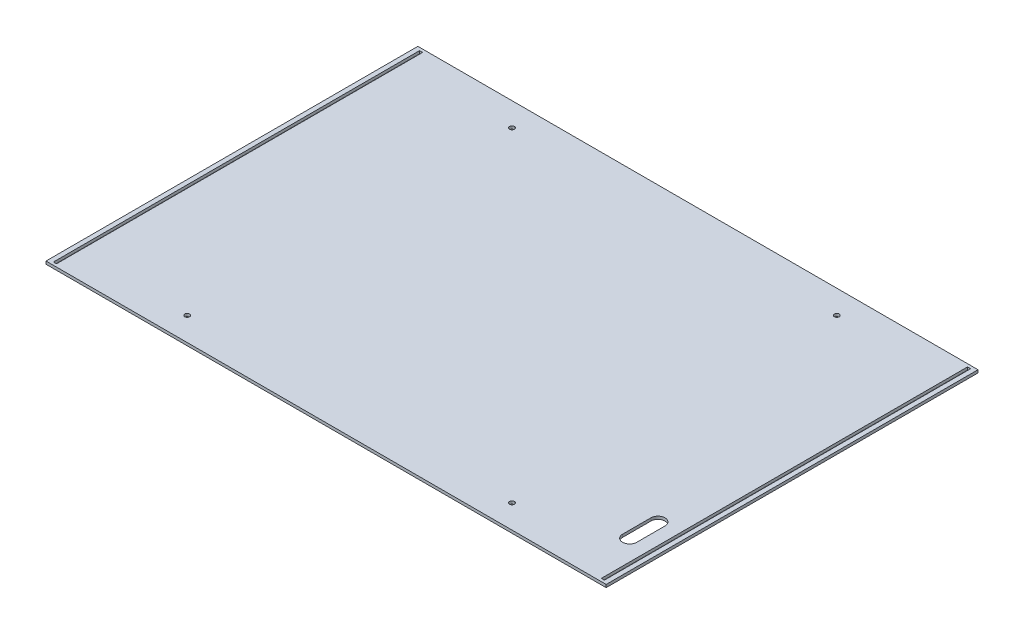
ISO-10303-21;
HEADER;
FILE_DESCRIPTION(('STEP AP214'),'2;1');
FILE_NAME('part.step','',(''),(''),'','','');
FILE_SCHEMA(('AUTOMOTIVE_DESIGN { 1 0 10303 214 1 1 1 1 }'));
ENDSEC;
DATA;
#1=APPLICATION_CONTEXT('core data for automotive mechanical design processes');
#2=APPLICATION_PROTOCOL_DEFINITION('international standard','automotive_design',2000,#1);
#3=PRODUCT_CONTEXT('',#1,'mechanical');
#4=PRODUCT('Part','Part','',(#3));
#5=PRODUCT_RELATED_PRODUCT_CATEGORY('part','',(#4));
#6=PRODUCT_DEFINITION_FORMATION('','',#4);
#7=PRODUCT_DEFINITION_CONTEXT('part definition',#1,'design');
#8=PRODUCT_DEFINITION('design','',#6,#7);
#9=PRODUCT_DEFINITION_SHAPE('','',#8);
#10=(LENGTH_UNIT() NAMED_UNIT(*) SI_UNIT(.MILLI.,.METRE.));
#11=(NAMED_UNIT(*) PLANE_ANGLE_UNIT() SI_UNIT($,.RADIAN.));
#12=(NAMED_UNIT(*) SI_UNIT($,.STERADIAN.) SOLID_ANGLE_UNIT());
#13=UNCERTAINTY_MEASURE_WITH_UNIT(LENGTH_MEASURE(1.E-05),#10,'distance_accuracy_value','');
#14=(GEOMETRIC_REPRESENTATION_CONTEXT(3) GLOBAL_UNCERTAINTY_ASSIGNED_CONTEXT((#13)) GLOBAL_UNIT_ASSIGNED_CONTEXT((#10,
#11,#12)) REPRESENTATION_CONTEXT('',''));
#15=CARTESIAN_POINT('',(0.,0.,0.));
#16=DIRECTION('',(0.,0.,1.));
#17=DIRECTION('',(1.,0.,0.));
#18=AXIS2_PLACEMENT_3D('',#15,#16,#17);
#19=CARTESIAN_POINT('',(297.5,3.,-197.5));
#20=DIRECTION('',(-1.,0.,0.));
#21=DIRECTION('',(0.,0.,1.));
#22=AXIS2_PLACEMENT_3D('',#19,#20,#21);
#23=PLANE('',#22);
#24=DIRECTION('',(0.,0.,-1.));
#25=VECTOR('',#24,1.);
#26=CARTESIAN_POINT('',(297.5,0.,-197.5));
#27=LINE('',#26,#25);
#28=CARTESIAN_POINT('',(297.5,0.,197.5));
#29=VERTEX_POINT('',#28);
#30=CARTESIAN_POINT('',(297.5,0.,-197.5));
#31=VERTEX_POINT('',#30);
#32=EDGE_CURVE('E266',#29,#31,#27,.T.);
#33=ORIENTED_EDGE('',*,*,#32,.T.);
#34=DIRECTION('',(0.,-1.,0.));
#35=VECTOR('',#34,1.);
#36=CARTESIAN_POINT('',(297.5,3.,-197.5));
#37=LINE('',#36,#35);
#38=CARTESIAN_POINT('',(297.5,3.,-197.5));
#39=VERTEX_POINT('',#38);
#40=EDGE_CURVE('E313',#39,#31,#37,.T.);
#41=ORIENTED_EDGE('',*,*,#40,.F.);
#42=DIRECTION('',(0.,0.,-1.));
#43=VECTOR('',#42,1.);
#44=CARTESIAN_POINT('',(297.5,3.,-197.5));
#45=LINE('',#44,#43);
#46=CARTESIAN_POINT('',(297.5,3.,197.5));
#47=VERTEX_POINT('',#46);
#48=EDGE_CURVE('E276',#47,#39,#45,.T.);
#49=ORIENTED_EDGE('',*,*,#48,.F.);
#50=DIRECTION('',(0.,-1.,0.));
#51=VECTOR('',#50,1.);
#52=CARTESIAN_POINT('',(297.5,3.,197.5));
#53=LINE('',#52,#51);
#54=EDGE_CURVE('E290',#47,#29,#53,.T.);
#55=ORIENTED_EDGE('',*,*,#54,.T.);
#56=EDGE_LOOP('',(#33,#41,#49,#55));
#57=FACE_BOUND('',#56,.T.);
#58=ADVANCED_FACE('F38',(#57),#23,.F.);
#59=CARTESIAN_POINT('',(-297.5,3.,-197.5));
#60=DIRECTION('',(0.,0.,1.));
#61=DIRECTION('',(1.,0.,0.));
#62=AXIS2_PLACEMENT_3D('',#59,#60,#61);
#63=PLANE('',#62);
#64=DIRECTION('',(-1.,0.,0.));
#65=VECTOR('',#64,1.);
#66=CARTESIAN_POINT('',(-297.5,0.,-197.5));
#67=LINE('',#66,#65);
#68=CARTESIAN_POINT('',(-297.5,0.,-197.5));
#69=VERTEX_POINT('',#68);
#70=EDGE_CURVE('E294',#31,#69,#67,.T.);
#71=ORIENTED_EDGE('',*,*,#70,.T.);
#72=DIRECTION('',(0.,-1.,0.));
#73=VECTOR('',#72,1.);
#74=CARTESIAN_POINT('',(-297.5,3.,-197.5));
#75=LINE('',#74,#73);
#76=CARTESIAN_POINT('',(-297.5,3.,-197.5));
#77=VERTEX_POINT('',#76);
#78=EDGE_CURVE('E309',#77,#69,#75,.T.);
#79=ORIENTED_EDGE('',*,*,#78,.F.);
#80=DIRECTION('',(-1.,0.,0.));
#81=VECTOR('',#80,1.);
#82=CARTESIAN_POINT('',(-297.5,3.,-197.5));
#83=LINE('',#82,#81);
#84=EDGE_CURVE('E280',#39,#77,#83,.T.);
#85=ORIENTED_EDGE('',*,*,#84,.F.);
#86=ORIENTED_EDGE('',*,*,#40,.T.);
#87=EDGE_LOOP('',(#71,#79,#85,#86));
#88=FACE_BOUND('',#87,.T.);
#89=ADVANCED_FACE('F360',(#88),#63,.F.);
#90=CARTESIAN_POINT('',(-297.5,3.,-197.5));
#91=DIRECTION('',(1.,0.,0.));
#92=DIRECTION('',(0.,0.,-1.));
#93=AXIS2_PLACEMENT_3D('',#90,#91,#92);
#94=PLANE('',#93);
#95=DIRECTION('',(0.,0.,1.));
#96=VECTOR('',#95,1.);
#97=CARTESIAN_POINT('',(-297.5,0.,-197.5));
#98=LINE('',#97,#96);
#99=CARTESIAN_POINT('',(-297.5,0.,197.5));
#100=VERTEX_POINT('',#99);
#101=EDGE_CURVE('E297',#69,#100,#98,.T.);
#102=ORIENTED_EDGE('',*,*,#101,.T.);
#103=DIRECTION('',(0.,-1.,0.));
#104=VECTOR('',#103,1.);
#105=CARTESIAN_POINT('',(-297.5,3.,197.5));
#106=LINE('',#105,#104);
#107=CARTESIAN_POINT('',(-297.5,3.,197.5));
#108=VERTEX_POINT('',#107);
#109=EDGE_CURVE('E305',#108,#100,#106,.T.);
#110=ORIENTED_EDGE('',*,*,#109,.F.);
#111=DIRECTION('',(0.,0.,1.));
#112=VECTOR('',#111,1.);
#113=CARTESIAN_POINT('',(-297.5,3.,-197.5));
#114=LINE('',#113,#112);
#115=EDGE_CURVE('E284',#77,#108,#114,.T.);
#116=ORIENTED_EDGE('',*,*,#115,.F.);
#117=ORIENTED_EDGE('',*,*,#78,.T.);
#118=EDGE_LOOP('',(#102,#110,#116,#117));
#119=FACE_BOUND('',#118,.T.);
#120=ADVANCED_FACE('F365',(#119),#94,.F.);
#121=CARTESIAN_POINT('',(-297.5,3.,197.5));
#122=DIRECTION('',(0.,0.,-1.));
#123=DIRECTION('',(-1.,0.,0.));
#124=AXIS2_PLACEMENT_3D('',#121,#122,#123);
#125=PLANE('',#124);
#126=DIRECTION('',(1.,0.,0.));
#127=VECTOR('',#126,1.);
#128=CARTESIAN_POINT('',(-297.5,0.,197.5));
#129=LINE('',#128,#127);
#130=EDGE_CURVE('E281',#100,#29,#129,.T.);
#131=ORIENTED_EDGE('',*,*,#130,.T.);
#132=ORIENTED_EDGE('',*,*,#54,.F.);
#133=DIRECTION('',(1.,0.,0.));
#134=VECTOR('',#133,1.);
#135=CARTESIAN_POINT('',(-297.5,3.,197.5));
#136=LINE('',#135,#134);
#137=EDGE_CURVE('E287',#108,#47,#136,.T.);
#138=ORIENTED_EDGE('',*,*,#137,.F.);
#139=ORIENTED_EDGE('',*,*,#109,.T.);
#140=EDGE_LOOP('',(#131,#132,#138,#139));
#141=FACE_BOUND('',#140,.T.);
#142=ADVANCED_FACE('F378',(#141),#125,.F.);
#143=CARTESIAN_POINT('',(0.,3.,0.));
#144=DIRECTION('',(0.,1.,0.));
#145=DIRECTION('',(0.,0.,1.));
#146=AXIS2_PLACEMENT_3D('',#143,#144,#145);
#147=PLANE('',#146);
#148=CARTESIAN_POINT('',(-172.5,3.,-172.5));
#149=DIRECTION('',(0.,1.,0.));
#150=DIRECTION('',(0.,0.,1.));
#151=AXIS2_PLACEMENT_3D('',#148,#149,#150);
#152=CIRCLE('',#151,2.59999999999999);
#153=CARTESIAN_POINT('',(-172.5,3.,-169.9));
#154=VERTEX_POINT('',#153);
#155=EDGE_CURVE('E183',#154,#154,#152,.T.);
#156=ORIENTED_EDGE('',*,*,#155,.F.);
#157=EDGE_LOOP('',(#156));
#158=FACE_BOUND('',#157,.T.);
#159=CARTESIAN_POINT('',(172.5,3.,172.5));
#160=DIRECTION('',(0.,1.,0.));
#161=DIRECTION('',(0.,0.,1.));
#162=AXIS2_PLACEMENT_3D('',#159,#160,#161);
#163=CIRCLE('',#162,2.59999999999999);
#164=CARTESIAN_POINT('',(172.5,3.,175.1));
#165=VERTEX_POINT('',#164);
#166=EDGE_CURVE('E468',#165,#165,#163,.T.);
#167=ORIENTED_EDGE('',*,*,#166,.F.);
#168=EDGE_LOOP('',(#167));
#169=FACE_BOUND('',#168,.T.);
#170=CARTESIAN_POINT('',(-172.5,3.,172.5));
#171=DIRECTION('',(0.,1.,0.));
#172=DIRECTION('',(0.,0.,1.));
#173=AXIS2_PLACEMENT_3D('',#170,#171,#172);
#174=CIRCLE('',#173,2.59999999999999);
#175=CARTESIAN_POINT('',(-172.5,3.,175.1));
#176=VERTEX_POINT('',#175);
#177=EDGE_CURVE('E443',#176,#176,#174,.T.);
#178=ORIENTED_EDGE('',*,*,#177,.F.);
#179=EDGE_LOOP('',(#178));
#180=FACE_BOUND('',#179,.T.);
#181=CARTESIAN_POINT('',(172.5,3.,-172.5));
#182=DIRECTION('',(0.,1.,0.));
#183=DIRECTION('',(0.,0.,1.));
#184=AXIS2_PLACEMENT_3D('',#181,#182,#183);
#185=CIRCLE('',#184,2.59999999999999);
#186=CARTESIAN_POINT('',(172.5,3.,-169.9));
#187=VERTEX_POINT('',#186);
#188=EDGE_CURVE('E455',#187,#187,#185,.T.);
#189=ORIENTED_EDGE('',*,*,#188,.F.);
#190=EDGE_LOOP('',(#189));
#191=FACE_BOUND('',#190,.T.);
#192=DIRECTION('',(0.,0.,1.));
#193=VECTOR('',#192,1.);
#194=CARTESIAN_POINT('',(-292.65,3.,0.));
#195=LINE('',#194,#193);
#196=CARTESIAN_POINT('',(-292.650000000001,3.,-194.500000000001));
#197=VERTEX_POINT('',#196);
#198=CARTESIAN_POINT('',(-292.65,3.,194.499999999999));
#199=VERTEX_POINT('',#198);
#200=EDGE_CURVE('E156',#197,#199,#195,.T.);
#201=ORIENTED_EDGE('',*,*,#200,.F.);
#202=DIRECTION('',(-1.,0.,0.));
#203=VECTOR('',#202,1.);
#204=CARTESIAN_POINT('',(0.,3.,-194.500000000001));
#205=LINE('',#204,#203);
#206=CARTESIAN_POINT('',(-289.35,3.,-194.500000000001));
#207=VERTEX_POINT('',#206);
#208=EDGE_CURVE('E242',#207,#197,#205,.T.);
#209=ORIENTED_EDGE('',*,*,#208,.F.);
#210=DIRECTION('',(0.,0.,-1.));
#211=VECTOR('',#210,1.);
#212=CARTESIAN_POINT('',(-289.35,3.,0.));
#213=LINE('',#212,#211);
#214=CARTESIAN_POINT('',(-289.35,3.,194.499999999999));
#215=VERTEX_POINT('',#214);
#216=EDGE_CURVE('E239',#215,#207,#213,.T.);
#217=ORIENTED_EDGE('',*,*,#216,.F.);
#218=DIRECTION('',(1.,0.,0.));
#219=VECTOR('',#218,1.);
#220=CARTESIAN_POINT('',(0.,3.,194.499999999999));
#221=LINE('',#220,#219);
#222=EDGE_CURVE('E236',#199,#215,#221,.T.);
#223=ORIENTED_EDGE('',*,*,#222,.F.);
#224=EDGE_LOOP('',(#201,#209,#217,#223));
#225=FACE_BOUND('',#224,.T.);
#226=DIRECTION('',(0.,0.,-1.));
#227=VECTOR('',#226,1.);
#228=CARTESIAN_POINT('',(292.65,3.,0.));
#229=LINE('',#228,#227);
#230=CARTESIAN_POINT('',(292.65,3.,194.500000000003));
#231=VERTEX_POINT('',#230);
#232=CARTESIAN_POINT('',(292.65,3.,-194.499999999997));
#233=VERTEX_POINT('',#232);
#234=EDGE_CURVE('E233',#231,#233,#229,.T.);
#235=ORIENTED_EDGE('',*,*,#234,.F.);
#236=DIRECTION('',(1.,0.,0.));
#237=VECTOR('',#236,1.);
#238=CARTESIAN_POINT('',(0.,3.,194.500000000003));
#239=LINE('',#238,#237);
#240=CARTESIAN_POINT('',(289.35,3.,194.500000000003));
#241=VERTEX_POINT('',#240);
#242=EDGE_CURVE('E230',#241,#231,#239,.T.);
#243=ORIENTED_EDGE('',*,*,#242,.F.);
#244=DIRECTION('',(0.,0.,1.));
#245=VECTOR('',#244,1.);
#246=CARTESIAN_POINT('',(289.35,3.,0.));
#247=LINE('',#246,#245);
#248=CARTESIAN_POINT('',(289.35,3.,-194.499999999997));
#249=VERTEX_POINT('',#248);
#250=EDGE_CURVE('E227',#249,#241,#247,.T.);
#251=ORIENTED_EDGE('',*,*,#250,.F.);
#252=DIRECTION('',(-1.,0.,0.));
#253=VECTOR('',#252,1.);
#254=CARTESIAN_POINT('',(0.,3.,-194.499999999997));
#255=LINE('',#254,#253);
#256=EDGE_CURVE('E193',#233,#249,#255,.T.);
#257=ORIENTED_EDGE('',*,*,#256,.F.);
#258=EDGE_LOOP('',(#235,#243,#251,#257));
#259=FACE_BOUND('',#258,.T.);
#260=CARTESIAN_POINT('',(267.5,3.,112.5));
#261=DIRECTION('',(0.,1.,0.));
#262=DIRECTION('',(0.,0.,1.));
#263=AXIS2_PLACEMENT_3D('',#260,#261,#262);
#264=CIRCLE('',#263,7.50000000000001);
#265=CARTESIAN_POINT('',(275.,3.,112.5));
#266=VERTEX_POINT('',#265);
#267=CARTESIAN_POINT('',(260.,3.,112.5));
#268=VERTEX_POINT('',#267);
#269=EDGE_CURVE('E247',#266,#268,#264,.T.);
#270=ORIENTED_EDGE('',*,*,#269,.F.);
#271=DIRECTION('',(0.,0.,-1.));
#272=VECTOR('',#271,1.);
#273=CARTESIAN_POINT('',(275.,3.,112.5));
#274=LINE('',#273,#272);
#275=CARTESIAN_POINT('',(275.,3.,142.5));
#276=VERTEX_POINT('',#275);
#277=EDGE_CURVE('E258',#276,#266,#274,.T.);
#278=ORIENTED_EDGE('',*,*,#277,.F.);
#279=CARTESIAN_POINT('',(267.5,3.,142.5));
#280=DIRECTION('',(0.,1.,0.));
#281=DIRECTION('',(0.,0.,1.));
#282=AXIS2_PLACEMENT_3D('',#279,#280,#281);
#283=CIRCLE('',#282,7.50000000000001);
#284=CARTESIAN_POINT('',(260.,3.,142.5));
#285=VERTEX_POINT('',#284);
#286=EDGE_CURVE('E254',#285,#276,#283,.T.);
#287=ORIENTED_EDGE('',*,*,#286,.F.);
#288=DIRECTION('',(0.,0.,1.));
#289=VECTOR('',#288,1.);
#290=CARTESIAN_POINT('',(260.,3.,112.5));
#291=LINE('',#290,#289);
#292=EDGE_CURVE('E250',#268,#285,#291,.T.);
#293=ORIENTED_EDGE('',*,*,#292,.F.);
#294=EDGE_LOOP('',(#270,#278,#287,#293));
#295=FACE_BOUND('',#294,.T.);
#296=ORIENTED_EDGE('',*,*,#48,.T.);
#297=ORIENTED_EDGE('',*,*,#84,.T.);
#298=ORIENTED_EDGE('',*,*,#115,.T.);
#299=ORIENTED_EDGE('',*,*,#137,.T.);
#300=EDGE_LOOP('',(#296,#297,#298,#299));
#301=FACE_BOUND('',#300,.T.);
#302=ADVANCED_FACE('F340',(#158,#169,#180,#191,#225,#259,#295,#301),#147,.T.);
#303=CARTESIAN_POINT('',(0.,0.,0.));
#304=DIRECTION('',(0.,1.,0.));
#305=DIRECTION('',(0.,0.,1.));
#306=AXIS2_PLACEMENT_3D('',#303,#304,#305);
#307=PLANE('',#306);
#308=CARTESIAN_POINT('',(-172.5,0.,-172.5));
#309=DIRECTION('',(0.,1.,0.));
#310=DIRECTION('',(0.,0.,1.));
#311=AXIS2_PLACEMENT_3D('',#308,#309,#310);
#312=CIRCLE('',#311,2.59999999999999);
#313=CARTESIAN_POINT('',(-172.5,0.,-169.9));
#314=VERTEX_POINT('',#313);
#315=EDGE_CURVE('E458',#314,#314,#312,.T.);
#316=ORIENTED_EDGE('',*,*,#315,.T.);
#317=EDGE_LOOP('',(#316));
#318=FACE_BOUND('',#317,.T.);
#319=CARTESIAN_POINT('',(172.5,0.,172.5));
#320=DIRECTION('',(0.,1.,0.));
#321=DIRECTION('',(0.,0.,1.));
#322=AXIS2_PLACEMENT_3D('',#319,#320,#321);
#323=CIRCLE('',#322,2.59999999999999);
#324=CARTESIAN_POINT('',(172.5,0.,175.1));
#325=VERTEX_POINT('',#324);
#326=EDGE_CURVE('E450',#325,#325,#323,.T.);
#327=ORIENTED_EDGE('',*,*,#326,.T.);
#328=EDGE_LOOP('',(#327));
#329=FACE_BOUND('',#328,.T.);
#330=CARTESIAN_POINT('',(-172.5,0.,172.5));
#331=DIRECTION('',(0.,1.,0.));
#332=DIRECTION('',(0.,0.,1.));
#333=AXIS2_PLACEMENT_3D('',#330,#331,#332);
#334=CIRCLE('',#333,2.59999999999999);
#335=CARTESIAN_POINT('',(-172.5,0.,175.1));
#336=VERTEX_POINT('',#335);
#337=EDGE_CURVE('E446',#336,#336,#334,.T.);
#338=ORIENTED_EDGE('',*,*,#337,.T.);
#339=EDGE_LOOP('',(#338));
#340=FACE_BOUND('',#339,.T.);
#341=CARTESIAN_POINT('',(172.5,0.,-172.5));
#342=DIRECTION('',(0.,1.,0.));
#343=DIRECTION('',(0.,0.,1.));
#344=AXIS2_PLACEMENT_3D('',#341,#342,#343);
#345=CIRCLE('',#344,2.59999999999999);
#346=CARTESIAN_POINT('',(172.5,0.,-169.9));
#347=VERTEX_POINT('',#346);
#348=EDGE_CURVE('E449',#347,#347,#345,.T.);
#349=ORIENTED_EDGE('',*,*,#348,.T.);
#350=EDGE_LOOP('',(#349));
#351=FACE_BOUND('',#350,.T.);
#352=DIRECTION('',(-1.,0.,0.));
#353=VECTOR('',#352,1.);
#354=CARTESIAN_POINT('',(-289.35,0.,-194.500000000001));
#355=LINE('',#354,#353);
#356=CARTESIAN_POINT('',(-289.35,0.,-194.500000000001));
#357=VERTEX_POINT('',#356);
#358=CARTESIAN_POINT('',(-292.650000000001,0.,-194.500000000001));
#359=VERTEX_POINT('',#358);
#360=EDGE_CURVE('E160',#357,#359,#355,.T.);
#361=ORIENTED_EDGE('',*,*,#360,.T.);
#362=DIRECTION('',(0.,0.,1.));
#363=VECTOR('',#362,1.);
#364=CARTESIAN_POINT('',(-292.650000000001,0.,-194.500000000001));
#365=LINE('',#364,#363);
#366=CARTESIAN_POINT('',(-292.65,0.,194.499999999999));
#367=VERTEX_POINT('',#366);
#368=EDGE_CURVE('E153',#359,#367,#365,.T.);
#369=ORIENTED_EDGE('',*,*,#368,.T.);
#370=DIRECTION('',(1.,0.,0.));
#371=VECTOR('',#370,1.);
#372=CARTESIAN_POINT('',(-289.35,0.,194.499999999999));
#373=LINE('',#372,#371);
#374=CARTESIAN_POINT('',(-289.35,0.,194.499999999999));
#375=VERTEX_POINT('',#374);
#376=EDGE_CURVE('E164',#367,#375,#373,.T.);
#377=ORIENTED_EDGE('',*,*,#376,.T.);
#378=DIRECTION('',(0.,0.,-1.));
#379=VECTOR('',#378,1.);
#380=CARTESIAN_POINT('',(-289.35,0.,-194.500000000001));
#381=LINE('',#380,#379);
#382=EDGE_CURVE('E170',#375,#357,#381,.T.);
#383=ORIENTED_EDGE('',*,*,#382,.T.);
#384=EDGE_LOOP('',(#361,#369,#377,#383));
#385=FACE_BOUND('',#384,.T.);
#386=DIRECTION('',(1.,0.,0.));
#387=VECTOR('',#386,1.);
#388=CARTESIAN_POINT('',(289.35,0.,194.500000000003));
#389=LINE('',#388,#387);
#390=CARTESIAN_POINT('',(289.35,0.,194.500000000003));
#391=VERTEX_POINT('',#390);
#392=CARTESIAN_POINT('',(292.65,0.,194.500000000003));
#393=VERTEX_POINT('',#392);
#394=EDGE_CURVE('E212',#391,#393,#389,.T.);
#395=ORIENTED_EDGE('',*,*,#394,.T.);
#396=DIRECTION('',(0.,0.,-1.));
#397=VECTOR('',#396,1.);
#398=CARTESIAN_POINT('',(292.65,0.,194.500000000003));
#399=LINE('',#398,#397);
#400=CARTESIAN_POINT('',(292.65,0.,-194.499999999997));
#401=VERTEX_POINT('',#400);
#402=EDGE_CURVE('E200',#393,#401,#399,.T.);
#403=ORIENTED_EDGE('',*,*,#402,.T.);
#404=DIRECTION('',(-1.,0.,0.));
#405=VECTOR('',#404,1.);
#406=CARTESIAN_POINT('',(289.35,0.,-194.499999999997));
#407=LINE('',#406,#405);
#408=CARTESIAN_POINT('',(289.35,0.,-194.499999999997));
#409=VERTEX_POINT('',#408);
#410=EDGE_CURVE('E204',#401,#409,#407,.T.);
#411=ORIENTED_EDGE('',*,*,#410,.T.);
#412=DIRECTION('',(0.,0.,1.));
#413=VECTOR('',#412,1.);
#414=CARTESIAN_POINT('',(289.35,0.,194.500000000003));
#415=LINE('',#414,#413);
#416=EDGE_CURVE('E208',#409,#391,#415,.T.);
#417=ORIENTED_EDGE('',*,*,#416,.T.);
#418=EDGE_LOOP('',(#395,#403,#411,#417));
#419=FACE_BOUND('',#418,.T.);
#420=DIRECTION('',(0.,0.,-1.));
#421=VECTOR('',#420,1.);
#422=CARTESIAN_POINT('',(275.,0.,0.));
#423=LINE('',#422,#421);
#424=CARTESIAN_POINT('',(275.,0.,142.5));
#425=VERTEX_POINT('',#424);
#426=CARTESIAN_POINT('',(275.,0.,112.5));
#427=VERTEX_POINT('',#426);
#428=EDGE_CURVE('E46',#425,#427,#423,.T.);
#429=ORIENTED_EDGE('',*,*,#428,.T.);
#430=CARTESIAN_POINT('',(267.5,0.,112.5));
#431=DIRECTION('',(0.,1.,0.));
#432=DIRECTION('',(0.,0.,1.));
#433=AXIS2_PLACEMENT_3D('',#430,#431,#432);
#434=CIRCLE('',#433,7.50000000000001);
#435=CARTESIAN_POINT('',(260.,0.,112.5));
#436=VERTEX_POINT('',#435);
#437=EDGE_CURVE('E11',#427,#436,#434,.T.);
#438=ORIENTED_EDGE('',*,*,#437,.T.);
#439=DIRECTION('',(0.,0.,1.));
#440=VECTOR('',#439,1.);
#441=CARTESIAN_POINT('',(260.,0.,0.));
#442=LINE('',#441,#440);
#443=CARTESIAN_POINT('',(260.,0.,142.5));
#444=VERTEX_POINT('',#443);
#445=EDGE_CURVE('E317',#436,#444,#442,.T.);
#446=ORIENTED_EDGE('',*,*,#445,.T.);
#447=CARTESIAN_POINT('',(267.5,0.,142.5));
#448=DIRECTION('',(0.,1.,0.));
#449=DIRECTION('',(0.,0.,1.));
#450=AXIS2_PLACEMENT_3D('',#447,#448,#449);
#451=CIRCLE('',#450,7.50000000000001);
#452=EDGE_CURVE('E321',#444,#425,#451,.T.);
#453=ORIENTED_EDGE('',*,*,#452,.T.);
#454=EDGE_LOOP('',(#429,#438,#446,#453));
#455=FACE_BOUND('',#454,.T.);
#456=ORIENTED_EDGE('',*,*,#32,.F.);
#457=ORIENTED_EDGE('',*,*,#130,.F.);
#458=ORIENTED_EDGE('',*,*,#101,.F.);
#459=ORIENTED_EDGE('',*,*,#70,.F.);
#460=EDGE_LOOP('',(#456,#457,#458,#459));
#461=FACE_BOUND('',#460,.T.);
#462=ADVANCED_FACE('F172',(#318,#329,#340,#351,#385,#419,#455,#461),#307,.F.);
#463=CARTESIAN_POINT('',(267.5,-7.,112.5));
#464=DIRECTION('',(0.,1.,0.));
#465=DIRECTION('',(0.,0.,1.));
#466=AXIS2_PLACEMENT_3D('',#463,#464,#465);
#467=CYLINDRICAL_SURFACE('',#466,7.50000000000001);
#468=DIRECTION('',(0.,1.,0.));
#469=VECTOR('',#468,1.);
#470=CARTESIAN_POINT('',(275.,-7.,112.5));
#471=LINE('',#470,#469);
#472=EDGE_CURVE('E263',#427,#266,#471,.T.);
#473=ORIENTED_EDGE('',*,*,#472,.T.);
#474=ORIENTED_EDGE('',*,*,#269,.T.);
#475=DIRECTION('',(0.,1.,0.));
#476=VECTOR('',#475,1.);
#477=CARTESIAN_POINT('',(260.,-7.,112.5));
#478=LINE('',#477,#476);
#479=EDGE_CURVE('E262',#436,#268,#478,.T.);
#480=ORIENTED_EDGE('',*,*,#479,.F.);
#481=ORIENTED_EDGE('',*,*,#437,.F.);
#482=EDGE_LOOP('',(#473,#474,#480,#481));
#483=FACE_BOUND('',#482,.T.);
#484=ADVANCED_FACE('F344',(#483),#467,.F.);
#485=CARTESIAN_POINT('',(275.,-7.,112.5));
#486=DIRECTION('',(1.,0.,0.));
#487=DIRECTION('',(0.,0.,-1.));
#488=AXIS2_PLACEMENT_3D('',#485,#486,#487);
#489=PLANE('',#488);
#490=DIRECTION('',(0.,1.,0.));
#491=VECTOR('',#490,1.);
#492=CARTESIAN_POINT('',(275.,-7.,142.5));
#493=LINE('',#492,#491);
#494=EDGE_CURVE('E267',#425,#276,#493,.T.);
#495=ORIENTED_EDGE('',*,*,#494,.T.);
#496=ORIENTED_EDGE('',*,*,#277,.T.);
#497=ORIENTED_EDGE('',*,*,#472,.F.);
#498=ORIENTED_EDGE('',*,*,#428,.F.);
#499=EDGE_LOOP('',(#495,#496,#497,#498));
#500=FACE_BOUND('',#499,.T.);
#501=ADVANCED_FACE('F332',(#500),#489,.F.);
#502=CARTESIAN_POINT('',(267.5,-7.,142.5));
#503=DIRECTION('',(0.,1.,0.));
#504=DIRECTION('',(0.,0.,1.));
#505=AXIS2_PLACEMENT_3D('',#502,#503,#504);
#506=CYLINDRICAL_SURFACE('',#505,7.50000000000001);
#507=DIRECTION('',(0.,1.,0.));
#508=VECTOR('',#507,1.);
#509=CARTESIAN_POINT('',(260.,-7.,142.5));
#510=LINE('',#509,#508);
#511=EDGE_CURVE('E270',#444,#285,#510,.T.);
#512=ORIENTED_EDGE('',*,*,#511,.T.);
#513=ORIENTED_EDGE('',*,*,#286,.T.);
#514=ORIENTED_EDGE('',*,*,#494,.F.);
#515=ORIENTED_EDGE('',*,*,#452,.F.);
#516=EDGE_LOOP('',(#512,#513,#514,#515));
#517=FACE_BOUND('',#516,.T.);
#518=ADVANCED_FACE('F334',(#517),#506,.F.);
#519=CARTESIAN_POINT('',(260.,-7.,112.5));
#520=DIRECTION('',(-1.,0.,0.));
#521=DIRECTION('',(0.,0.,1.));
#522=AXIS2_PLACEMENT_3D('',#519,#520,#521);
#523=PLANE('',#522);
#524=ORIENTED_EDGE('',*,*,#479,.T.);
#525=ORIENTED_EDGE('',*,*,#292,.T.);
#526=ORIENTED_EDGE('',*,*,#511,.F.);
#527=ORIENTED_EDGE('',*,*,#445,.F.);
#528=EDGE_LOOP('',(#524,#525,#526,#527));
#529=FACE_BOUND('',#528,.T.);
#530=ADVANCED_FACE('F346',(#529),#523,.F.);
#531=CARTESIAN_POINT('',(292.65,0.,194.500000000003));
#532=DIRECTION('',(1.,0.,0.));
#533=DIRECTION('',(0.,0.,-1.));
#534=AXIS2_PLACEMENT_3D('',#531,#532,#533);
#535=PLANE('',#534);
#536=ORIENTED_EDGE('',*,*,#234,.T.);
#537=DIRECTION('',(0.,1.,0.));
#538=VECTOR('',#537,1.);
#539=CARTESIAN_POINT('',(292.65,0.,-194.499999999997));
#540=LINE('',#539,#538);
#541=EDGE_CURVE('E61',#401,#233,#540,.T.);
#542=ORIENTED_EDGE('',*,*,#541,.F.);
#543=ORIENTED_EDGE('',*,*,#402,.F.);
#544=DIRECTION('',(0.,1.,0.));
#545=VECTOR('',#544,1.);
#546=CARTESIAN_POINT('',(292.65,0.,194.500000000003));
#547=LINE('',#546,#545);
#548=EDGE_CURVE('E176',#393,#231,#547,.T.);
#549=ORIENTED_EDGE('',*,*,#548,.T.);
#550=EDGE_LOOP('',(#536,#542,#543,#549));
#551=FACE_BOUND('',#550,.T.);
#552=ADVANCED_FACE('F348',(#551),#535,.F.);
#553=CARTESIAN_POINT('',(289.35,0.,194.500000000003));
#554=DIRECTION('',(0.,0.,1.));
#555=DIRECTION('',(1.,0.,0.));
#556=AXIS2_PLACEMENT_3D('',#553,#554,#555);
#557=PLANE('',#556);
#558=ORIENTED_EDGE('',*,*,#242,.T.);
#559=ORIENTED_EDGE('',*,*,#548,.F.);
#560=ORIENTED_EDGE('',*,*,#394,.F.);
#561=DIRECTION('',(0.,1.,0.));
#562=VECTOR('',#561,1.);
#563=CARTESIAN_POINT('',(289.35,0.,194.500000000003));
#564=LINE('',#563,#562);
#565=EDGE_CURVE('E180',#391,#241,#564,.T.);
#566=ORIENTED_EDGE('',*,*,#565,.T.);
#567=EDGE_LOOP('',(#558,#559,#560,#566));
#568=FACE_BOUND('',#567,.T.);
#569=ADVANCED_FACE('F354',(#568),#557,.F.);
#570=CARTESIAN_POINT('',(289.35,0.,194.500000000003));
#571=DIRECTION('',(-1.,0.,0.));
#572=DIRECTION('',(0.,0.,1.));
#573=AXIS2_PLACEMENT_3D('',#570,#571,#572);
#574=PLANE('',#573);
#575=ORIENTED_EDGE('',*,*,#250,.T.);
#576=ORIENTED_EDGE('',*,*,#565,.F.);
#577=ORIENTED_EDGE('',*,*,#416,.F.);
#578=DIRECTION('',(0.,1.,0.));
#579=VECTOR('',#578,1.);
#580=CARTESIAN_POINT('',(289.35,0.,-194.499999999997));
#581=LINE('',#580,#579);
#582=EDGE_CURVE('E219',#409,#249,#581,.T.);
#583=ORIENTED_EDGE('',*,*,#582,.T.);
#584=EDGE_LOOP('',(#575,#576,#577,#583));
#585=FACE_BOUND('',#584,.T.);
#586=ADVANCED_FACE('F404',(#585),#574,.F.);
#587=CARTESIAN_POINT('',(289.35,0.,-194.499999999997));
#588=DIRECTION('',(0.,0.,-1.));
#589=DIRECTION('',(-1.,0.,0.));
#590=AXIS2_PLACEMENT_3D('',#587,#588,#589);
#591=PLANE('',#590);
#592=ORIENTED_EDGE('',*,*,#256,.T.);
#593=ORIENTED_EDGE('',*,*,#582,.F.);
#594=ORIENTED_EDGE('',*,*,#410,.F.);
#595=ORIENTED_EDGE('',*,*,#541,.T.);
#596=EDGE_LOOP('',(#592,#593,#594,#595));
#597=FACE_BOUND('',#596,.T.);
#598=ADVANCED_FACE('F401',(#597),#591,.F.);
#599=CARTESIAN_POINT('',(-292.650000000001,0.,-194.500000000001));
#600=DIRECTION('',(-1.,0.,0.));
#601=DIRECTION('',(0.,0.,1.));
#602=AXIS2_PLACEMENT_3D('',#599,#600,#601);
#603=PLANE('',#602);
#604=ORIENTED_EDGE('',*,*,#200,.T.);
#605=DIRECTION('',(0.,1.,0.));
#606=VECTOR('',#605,1.);
#607=CARTESIAN_POINT('',(-292.65,0.,194.499999999999));
#608=LINE('',#607,#606);
#609=EDGE_CURVE('E53',#367,#199,#608,.T.);
#610=ORIENTED_EDGE('',*,*,#609,.F.);
#611=ORIENTED_EDGE('',*,*,#368,.F.);
#612=DIRECTION('',(0.,1.,0.));
#613=VECTOR('',#612,1.);
#614=CARTESIAN_POINT('',(-292.650000000001,0.,-194.500000000001));
#615=LINE('',#614,#613);
#616=EDGE_CURVE('E190',#359,#197,#615,.T.);
#617=ORIENTED_EDGE('',*,*,#616,.T.);
#618=EDGE_LOOP('',(#604,#610,#611,#617));
#619=FACE_BOUND('',#618,.T.);
#620=ADVANCED_FACE('F150',(#619),#603,.F.);
#621=CARTESIAN_POINT('',(-289.35,0.,-194.500000000001));
#622=DIRECTION('',(0.,0.,-1.));
#623=DIRECTION('',(-1.,0.,0.));
#624=AXIS2_PLACEMENT_3D('',#621,#622,#623);
#625=PLANE('',#624);
#626=ORIENTED_EDGE('',*,*,#208,.T.);
#627=ORIENTED_EDGE('',*,*,#616,.F.);
#628=ORIENTED_EDGE('',*,*,#360,.F.);
#629=DIRECTION('',(0.,1.,0.));
#630=VECTOR('',#629,1.);
#631=CARTESIAN_POINT('',(-289.35,0.,-194.500000000001));
#632=LINE('',#631,#630);
#633=EDGE_CURVE('E194',#357,#207,#632,.T.);
#634=ORIENTED_EDGE('',*,*,#633,.T.);
#635=EDGE_LOOP('',(#626,#627,#628,#634));
#636=FACE_BOUND('',#635,.T.);
#637=ADVANCED_FACE('F413',(#636),#625,.F.);
#638=CARTESIAN_POINT('',(-289.35,0.,-194.500000000001));
#639=DIRECTION('',(1.,0.,0.));
#640=DIRECTION('',(0.,0.,-1.));
#641=AXIS2_PLACEMENT_3D('',#638,#639,#640);
#642=PLANE('',#641);
#643=ORIENTED_EDGE('',*,*,#216,.T.);
#644=ORIENTED_EDGE('',*,*,#633,.F.);
#645=ORIENTED_EDGE('',*,*,#382,.F.);
#646=DIRECTION('',(0.,1.,0.));
#647=VECTOR('',#646,1.);
#648=CARTESIAN_POINT('',(-289.35,0.,194.499999999999));
#649=LINE('',#648,#647);
#650=EDGE_CURVE('E159',#375,#215,#649,.T.);
#651=ORIENTED_EDGE('',*,*,#650,.T.);
#652=EDGE_LOOP('',(#643,#644,#645,#651));
#653=FACE_BOUND('',#652,.T.);
#654=ADVANCED_FACE('F417',(#653),#642,.F.);
#655=CARTESIAN_POINT('',(-289.35,0.,194.499999999999));
#656=DIRECTION('',(0.,0.,1.));
#657=DIRECTION('',(1.,0.,0.));
#658=AXIS2_PLACEMENT_3D('',#655,#656,#657);
#659=PLANE('',#658);
#660=ORIENTED_EDGE('',*,*,#222,.T.);
#661=ORIENTED_EDGE('',*,*,#650,.F.);
#662=ORIENTED_EDGE('',*,*,#376,.F.);
#663=ORIENTED_EDGE('',*,*,#609,.T.);
#664=EDGE_LOOP('',(#660,#661,#662,#663));
#665=FACE_BOUND('',#664,.T.);
#666=ADVANCED_FACE('F165',(#665),#659,.F.);
#667=CARTESIAN_POINT('',(172.5,0.,-172.5));
#668=DIRECTION('',(0.,1.,0.));
#669=DIRECTION('',(0.,0.,1.));
#670=AXIS2_PLACEMENT_3D('',#667,#668,#669);
#671=CYLINDRICAL_SURFACE('',#670,2.59999999999999);
#672=ORIENTED_EDGE('',*,*,#188,.T.);
#673=EDGE_LOOP('',(#672));
#674=FACE_BOUND('',#673,.T.);
#675=ORIENTED_EDGE('',*,*,#348,.F.);
#676=EDGE_LOOP('',(#675));
#677=FACE_BOUND('',#676,.T.);
#678=ADVANCED_FACE('F416',(#674,#677),#671,.F.);
#679=CARTESIAN_POINT('',(-172.5,0.,172.5));
#680=DIRECTION('',(0.,1.,0.));
#681=DIRECTION('',(0.,0.,1.));
#682=AXIS2_PLACEMENT_3D('',#679,#680,#681);
#683=CYLINDRICAL_SURFACE('',#682,2.59999999999999);
#684=ORIENTED_EDGE('',*,*,#177,.T.);
#685=EDGE_LOOP('',(#684));
#686=FACE_BOUND('',#685,.T.);
#687=ORIENTED_EDGE('',*,*,#337,.F.);
#688=EDGE_LOOP('',(#687));
#689=FACE_BOUND('',#688,.T.);
#690=ADVANCED_FACE('F426',(#686,#689),#683,.F.);
#691=CARTESIAN_POINT('',(172.5,0.,172.5));
#692=DIRECTION('',(0.,1.,0.));
#693=DIRECTION('',(0.,0.,1.));
#694=AXIS2_PLACEMENT_3D('',#691,#692,#693);
#695=CYLINDRICAL_SURFACE('',#694,2.59999999999999);
#696=ORIENTED_EDGE('',*,*,#166,.T.);
#697=EDGE_LOOP('',(#696));
#698=FACE_BOUND('',#697,.T.);
#699=ORIENTED_EDGE('',*,*,#326,.F.);
#700=EDGE_LOOP('',(#699));
#701=FACE_BOUND('',#700,.T.);
#702=ADVANCED_FACE('F431',(#698,#701),#695,.F.);
#703=CARTESIAN_POINT('',(-172.5,0.,-172.5));
#704=DIRECTION('',(0.,1.,0.));
#705=DIRECTION('',(0.,0.,1.));
#706=AXIS2_PLACEMENT_3D('',#703,#704,#705);
#707=CYLINDRICAL_SURFACE('',#706,2.59999999999999);
#708=ORIENTED_EDGE('',*,*,#155,.T.);
#709=EDGE_LOOP('',(#708));
#710=FACE_BOUND('',#709,.T.);
#711=ORIENTED_EDGE('',*,*,#315,.F.);
#712=EDGE_LOOP('',(#711));
#713=FACE_BOUND('',#712,.T.);
#714=ADVANCED_FACE('F428',(#710,#713),#707,.F.);
#715=CLOSED_SHELL('',(#58,#89,#120,#142,#302,#462,#484,#501,#518,#530,#552,#569,#586,#598,#620,
#637,#654,#666,#678,#690,#702,#714));
#716=MANIFOLD_SOLID_BREP('B2',#715);
#717=ADVANCED_BREP_SHAPE_REPRESENTATION('',(#18,#716),#14);
#718=SHAPE_DEFINITION_REPRESENTATION(#9,#717);
ENDSEC;
END-ISO-10303-21;
